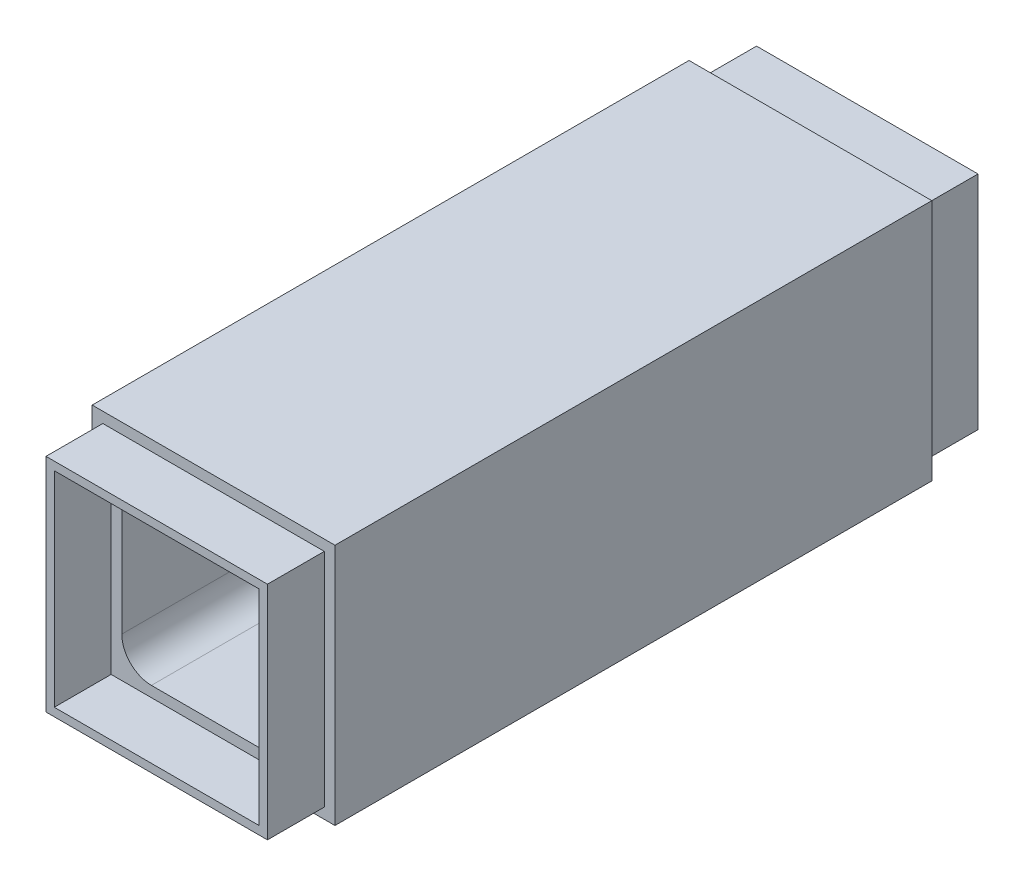
ISO-10303-21;
HEADER;
FILE_DESCRIPTION(('STEP AP214'),'2;1');
FILE_NAME('part.step','',(''),(''),'','','');
FILE_SCHEMA(('AUTOMOTIVE_DESIGN { 1 0 10303 214 1 1 1 1 }'));
ENDSEC;
DATA;
#1=APPLICATION_CONTEXT('core data for automotive mechanical design processes');
#2=APPLICATION_PROTOCOL_DEFINITION('international standard','automotive_design',2000,#1);
#3=PRODUCT_CONTEXT('',#1,'mechanical');
#4=PRODUCT('Part','Part','',(#3));
#5=PRODUCT_RELATED_PRODUCT_CATEGORY('part','',(#4));
#6=PRODUCT_DEFINITION_FORMATION('','',#4);
#7=PRODUCT_DEFINITION_CONTEXT('part definition',#1,'design');
#8=PRODUCT_DEFINITION('design','',#6,#7);
#9=PRODUCT_DEFINITION_SHAPE('','',#8);
#10=(LENGTH_UNIT() NAMED_UNIT(*) SI_UNIT(.MILLI.,.METRE.));
#11=(NAMED_UNIT(*) PLANE_ANGLE_UNIT() SI_UNIT($,.RADIAN.));
#12=(NAMED_UNIT(*) SI_UNIT($,.STERADIAN.) SOLID_ANGLE_UNIT());
#13=UNCERTAINTY_MEASURE_WITH_UNIT(LENGTH_MEASURE(1.E-05),#10,'distance_accuracy_value','');
#14=(GEOMETRIC_REPRESENTATION_CONTEXT(3) GLOBAL_UNCERTAINTY_ASSIGNED_CONTEXT((#13)) GLOBAL_UNIT_ASSIGNED_CONTEXT((#10,
#11,#12)) REPRESENTATION_CONTEXT('',''));
#15=CARTESIAN_POINT('',(0.,0.,0.));
#16=DIRECTION('',(0.,0.,1.));
#17=DIRECTION('',(1.,0.,0.));
#18=AXIS2_PLACEMENT_3D('',#15,#16,#17);
#19=CARTESIAN_POINT('',(0.,0.,-152.4));
#20=DIRECTION('',(-1.,0.,0.));
#21=DIRECTION('',(0.,0.,1.));
#22=AXIS2_PLACEMENT_3D('',#19,#20,#21);
#23=PLANE('',#22);
#24=DIRECTION('',(0.,0.,1.));
#25=VECTOR('',#24,1.);
#26=CARTESIAN_POINT('',(0.,52.07,-152.4));
#27=LINE('',#26,#25);
#28=CARTESIAN_POINT('',(0.,52.07,-140.208));
#29=VERTEX_POINT('',#28);
#30=CARTESIAN_POINT('',(0.,52.07,-12.192));
#31=VERTEX_POINT('',#30);
#32=EDGE_CURVE('E456',#29,#31,#27,.T.);
#33=ORIENTED_EDGE('',*,*,#32,.F.);
#34=DIRECTION('',(0.,-1.,0.));
#35=VECTOR('',#34,1.);
#36=CARTESIAN_POINT('',(0.,0.,-140.208));
#37=LINE('',#36,#35);
#38=CARTESIAN_POINT('',(0.,0.,-140.208));
#39=VERTEX_POINT('',#38);
#40=EDGE_CURVE('E336',#29,#39,#37,.T.);
#41=ORIENTED_EDGE('',*,*,#40,.T.);
#42=DIRECTION('',(0.,0.,1.));
#43=VECTOR('',#42,1.);
#44=CARTESIAN_POINT('',(0.,0.,-152.4));
#45=LINE('',#44,#43);
#46=CARTESIAN_POINT('',(0.,0.,-12.1920000000001));
#47=VERTEX_POINT('',#46);
#48=EDGE_CURVE('E448',#39,#47,#45,.T.);
#49=ORIENTED_EDGE('',*,*,#48,.T.);
#50=DIRECTION('',(0.,-1.,0.));
#51=VECTOR('',#50,1.);
#52=CARTESIAN_POINT('',(0.,0.,-12.192));
#53=LINE('',#52,#51);
#54=EDGE_CURVE('E415',#31,#47,#53,.T.);
#55=ORIENTED_EDGE('',*,*,#54,.F.);
#56=EDGE_LOOP('',(#33,#41,#49,#55));
#57=FACE_BOUND('',#56,.T.);
#58=ADVANCED_FACE('F85',(#57),#23,.T.);
#59=CARTESIAN_POINT('',(0.,52.07,-152.4));
#60=DIRECTION('',(0.,1.,0.));
#61=DIRECTION('',(0.,0.,1.));
#62=AXIS2_PLACEMENT_3D('',#59,#60,#61);
#63=PLANE('',#62);
#64=DIRECTION('',(0.,0.,1.));
#65=VECTOR('',#64,1.);
#66=CARTESIAN_POINT('',(52.07,52.07,-152.4));
#67=LINE('',#66,#65);
#68=CARTESIAN_POINT('',(52.07,52.07,-140.208));
#69=VERTEX_POINT('',#68);
#70=CARTESIAN_POINT('',(52.07,52.07,-12.192));
#71=VERTEX_POINT('',#70);
#72=EDGE_CURVE('E459',#69,#71,#67,.T.);
#73=ORIENTED_EDGE('',*,*,#72,.F.);
#74=DIRECTION('',(-1.,0.,0.));
#75=VECTOR('',#74,1.);
#76=CARTESIAN_POINT('',(0.,52.07,-140.208));
#77=LINE('',#76,#75);
#78=EDGE_CURVE('E326',#69,#29,#77,.T.);
#79=ORIENTED_EDGE('',*,*,#78,.T.);
#80=ORIENTED_EDGE('',*,*,#32,.T.);
#81=DIRECTION('',(-1.,0.,0.));
#82=VECTOR('',#81,1.);
#83=CARTESIAN_POINT('',(0.,52.07,-12.192));
#84=LINE('',#83,#82);
#85=EDGE_CURVE('E412',#71,#31,#84,.T.);
#86=ORIENTED_EDGE('',*,*,#85,.F.);
#87=EDGE_LOOP('',(#73,#79,#80,#86));
#88=FACE_BOUND('',#87,.T.);
#89=ADVANCED_FACE('F536',(#88),#63,.T.);
#90=CARTESIAN_POINT('',(52.07,0.,-152.4));
#91=DIRECTION('',(1.,0.,0.));
#92=DIRECTION('',(0.,0.,-1.));
#93=AXIS2_PLACEMENT_3D('',#90,#91,#92);
#94=PLANE('',#93);
#95=DIRECTION('',(0.,0.,1.));
#96=VECTOR('',#95,1.);
#97=CARTESIAN_POINT('',(52.07,0.,-152.4));
#98=LINE('',#97,#96);
#99=CARTESIAN_POINT('',(52.07,0.,-140.208));
#100=VERTEX_POINT('',#99);
#101=CARTESIAN_POINT('',(52.07,0.,-12.192));
#102=VERTEX_POINT('',#101);
#103=EDGE_CURVE('E461',#100,#102,#98,.T.);
#104=ORIENTED_EDGE('',*,*,#103,.F.);
#105=DIRECTION('',(0.,1.,0.));
#106=VECTOR('',#105,1.);
#107=CARTESIAN_POINT('',(52.07,0.,-140.208));
#108=LINE('',#107,#106);
#109=EDGE_CURVE('E329',#100,#69,#108,.T.);
#110=ORIENTED_EDGE('',*,*,#109,.T.);
#111=ORIENTED_EDGE('',*,*,#72,.T.);
#112=DIRECTION('',(0.,1.,0.));
#113=VECTOR('',#112,1.);
#114=CARTESIAN_POINT('',(52.07,0.,-12.192));
#115=LINE('',#114,#113);
#116=EDGE_CURVE('E422',#102,#71,#115,.T.);
#117=ORIENTED_EDGE('',*,*,#116,.F.);
#118=EDGE_LOOP('',(#104,#110,#111,#117));
#119=FACE_BOUND('',#118,.T.);
#120=ADVANCED_FACE('F541',(#119),#94,.T.);
#121=CARTESIAN_POINT('',(0.,0.,-152.4));
#122=DIRECTION('',(0.,-1.,0.));
#123=DIRECTION('',(0.,0.,-1.));
#124=AXIS2_PLACEMENT_3D('',#121,#122,#123);
#125=PLANE('',#124);
#126=ORIENTED_EDGE('',*,*,#48,.F.);
#127=DIRECTION('',(1.,0.,0.));
#128=VECTOR('',#127,1.);
#129=CARTESIAN_POINT('',(0.,0.,-140.208));
#130=LINE('',#129,#128);
#131=EDGE_CURVE('E333',#39,#100,#130,.T.);
#132=ORIENTED_EDGE('',*,*,#131,.T.);
#133=ORIENTED_EDGE('',*,*,#103,.T.);
#134=DIRECTION('',(1.,0.,0.));
#135=VECTOR('',#134,1.);
#136=CARTESIAN_POINT('',(0.,0.,-12.192));
#137=LINE('',#136,#135);
#138=EDGE_CURVE('E419',#47,#102,#137,.T.);
#139=ORIENTED_EDGE('',*,*,#138,.F.);
#140=EDGE_LOOP('',(#126,#132,#133,#139));
#141=FACE_BOUND('',#140,.T.);
#142=ADVANCED_FACE('F546',(#141),#125,.T.);
#143=CARTESIAN_POINT('',(6.35,45.72,-152.4));
#144=DIRECTION('',(-1.,0.,0.));
#145=DIRECTION('',(0.,-1.,0.));
#146=AXIS2_PLACEMENT_3D('',#143,#144,#145);
#147=PLANE('',#146);
#148=DIRECTION('',(0.,1.,0.));
#149=VECTOR('',#148,1.);
#150=CARTESIAN_POINT('',(6.35000000000001,0.,-140.208));
#151=LINE('',#150,#149);
#152=CARTESIAN_POINT('',(6.35,12.7,-140.208));
#153=VERTEX_POINT('',#152);
#154=CARTESIAN_POINT('',(6.35,39.37,-140.208));
#155=VERTEX_POINT('',#154);
#156=EDGE_CURVE('E310',#153,#155,#151,.T.);
#157=ORIENTED_EDGE('',*,*,#156,.T.);
#158=DIRECTION('',(0.,0.,1.));
#159=VECTOR('',#158,1.);
#160=CARTESIAN_POINT('',(6.35,39.37,-12.192));
#161=LINE('',#160,#159);
#162=CARTESIAN_POINT('',(6.35,39.37,-12.192));
#163=VERTEX_POINT('',#162);
#164=EDGE_CURVE('E465',#155,#163,#161,.T.);
#165=ORIENTED_EDGE('',*,*,#164,.T.);
#166=DIRECTION('',(0.,1.,0.));
#167=VECTOR('',#166,1.);
#168=CARTESIAN_POINT('',(6.35000000000001,0.,-12.192));
#169=LINE('',#168,#167);
#170=CARTESIAN_POINT('',(6.35,12.7,-12.192));
#171=VERTEX_POINT('',#170);
#172=EDGE_CURVE('E386',#171,#163,#169,.T.);
#173=ORIENTED_EDGE('',*,*,#172,.F.);
#174=DIRECTION('',(0.,0.,1.));
#175=VECTOR('',#174,1.);
#176=CARTESIAN_POINT('',(6.35,12.7,-140.208));
#177=LINE('',#176,#175);
#178=EDGE_CURVE('E458',#171,#153,#177,.F.);
#179=ORIENTED_EDGE('',*,*,#178,.T.);
#180=EDGE_LOOP('',(#157,#165,#173,#179));
#181=FACE_BOUND('',#180,.T.);
#182=ADVANCED_FACE('F495',(#181),#147,.F.);
#183=CARTESIAN_POINT('',(6.35,45.72,-152.4));
#184=DIRECTION('',(0.,1.,0.));
#185=DIRECTION('',(0.,0.,1.));
#186=AXIS2_PLACEMENT_3D('',#183,#184,#185);
#187=PLANE('',#186);
#188=DIRECTION('',(1.,0.,0.));
#189=VECTOR('',#188,1.);
#190=CARTESIAN_POINT('',(0.,45.72,-12.192));
#191=LINE('',#190,#189);
#192=CARTESIAN_POINT('',(12.7,45.72,-12.192));
#193=VERTEX_POINT('',#192);
#194=CARTESIAN_POINT('',(39.37,45.72,-12.192));
#195=VERTEX_POINT('',#194);
#196=EDGE_CURVE('E389',#193,#195,#191,.T.);
#197=ORIENTED_EDGE('',*,*,#196,.F.);
#198=DIRECTION('',(0.,0.,1.));
#199=VECTOR('',#198,1.);
#200=CARTESIAN_POINT('',(12.7,45.72,-140.208));
#201=LINE('',#200,#199);
#202=CARTESIAN_POINT('',(12.7,45.72,-140.208));
#203=VERTEX_POINT('',#202);
#204=EDGE_CURVE('E471',#193,#203,#201,.F.);
#205=ORIENTED_EDGE('',*,*,#204,.T.);
#206=DIRECTION('',(1.,0.,0.));
#207=VECTOR('',#206,1.);
#208=CARTESIAN_POINT('',(0.,45.72,-140.208));
#209=LINE('',#208,#207);
#210=CARTESIAN_POINT('',(39.37,45.72,-140.208));
#211=VERTEX_POINT('',#210);
#212=EDGE_CURVE('E307',#203,#211,#209,.T.);
#213=ORIENTED_EDGE('',*,*,#212,.T.);
#214=DIRECTION('',(0.,0.,1.));
#215=VECTOR('',#214,1.);
#216=CARTESIAN_POINT('',(39.37,45.72,-12.192));
#217=LINE('',#216,#215);
#218=EDGE_CURVE('E468',#211,#195,#217,.T.);
#219=ORIENTED_EDGE('',*,*,#218,.T.);
#220=EDGE_LOOP('',(#197,#205,#213,#219));
#221=FACE_BOUND('',#220,.T.);
#222=ADVANCED_FACE('F520',(#221),#187,.F.);
#223=CARTESIAN_POINT('',(45.72,45.72,-152.4));
#224=DIRECTION('',(1.,0.,0.));
#225=DIRECTION('',(0.,1.,0.));
#226=AXIS2_PLACEMENT_3D('',#223,#224,#225);
#227=PLANE('',#226);
#228=DIRECTION('',(0.,-1.,0.));
#229=VECTOR('',#228,1.);
#230=CARTESIAN_POINT('',(45.72,0.,-12.192));
#231=LINE('',#230,#229);
#232=CARTESIAN_POINT('',(45.72,39.37,-12.192));
#233=VERTEX_POINT('',#232);
#234=CARTESIAN_POINT('',(45.72,12.7,-12.192));
#235=VERTEX_POINT('',#234);
#236=EDGE_CURVE('E382',#233,#235,#231,.T.);
#237=ORIENTED_EDGE('',*,*,#236,.F.);
#238=DIRECTION('',(0.,0.,1.));
#239=VECTOR('',#238,1.);
#240=CARTESIAN_POINT('',(45.72,39.37,-140.208));
#241=LINE('',#240,#239);
#242=CARTESIAN_POINT('',(45.72,39.37,-140.208));
#243=VERTEX_POINT('',#242);
#244=EDGE_CURVE('E476',#233,#243,#241,.F.);
#245=ORIENTED_EDGE('',*,*,#244,.T.);
#246=DIRECTION('',(0.,-1.,0.));
#247=VECTOR('',#246,1.);
#248=CARTESIAN_POINT('',(45.72,0.,-140.208));
#249=LINE('',#248,#247);
#250=CARTESIAN_POINT('',(45.72,12.7,-140.208));
#251=VERTEX_POINT('',#250);
#252=EDGE_CURVE('E304',#243,#251,#249,.T.);
#253=ORIENTED_EDGE('',*,*,#252,.T.);
#254=DIRECTION('',(0.,0.,1.));
#255=VECTOR('',#254,1.);
#256=CARTESIAN_POINT('',(45.72,12.7,-12.1920000000001));
#257=LINE('',#256,#255);
#258=EDGE_CURVE('E473',#251,#235,#257,.T.);
#259=ORIENTED_EDGE('',*,*,#258,.T.);
#260=EDGE_LOOP('',(#237,#245,#253,#259));
#261=FACE_BOUND('',#260,.T.);
#262=ADVANCED_FACE('F511',(#261),#227,.F.);
#263=CARTESIAN_POINT('',(6.35,6.35,-152.4));
#264=DIRECTION('',(0.,-1.,0.));
#265=DIRECTION('',(0.,0.,-1.));
#266=AXIS2_PLACEMENT_3D('',#263,#264,#265);
#267=PLANE('',#266);
#268=DIRECTION('',(-1.,0.,0.));
#269=VECTOR('',#268,1.);
#270=CARTESIAN_POINT('',(0.,6.35,-12.192));
#271=LINE('',#270,#269);
#272=CARTESIAN_POINT('',(39.37,6.35,-12.192));
#273=VERTEX_POINT('',#272);
#274=CARTESIAN_POINT('',(12.7,6.35,-12.192));
#275=VERTEX_POINT('',#274);
#276=EDGE_CURVE('E384',#273,#275,#271,.T.);
#277=ORIENTED_EDGE('',*,*,#276,.F.);
#278=DIRECTION('',(0.,0.,1.));
#279=VECTOR('',#278,1.);
#280=CARTESIAN_POINT('',(39.37,6.35,-140.208));
#281=LINE('',#280,#279);
#282=CARTESIAN_POINT('',(39.37,6.35,-140.208));
#283=VERTEX_POINT('',#282);
#284=EDGE_CURVE('E480',#273,#283,#281,.F.);
#285=ORIENTED_EDGE('',*,*,#284,.T.);
#286=DIRECTION('',(-1.,0.,0.));
#287=VECTOR('',#286,1.);
#288=CARTESIAN_POINT('',(0.,6.35,-140.208));
#289=LINE('',#288,#287);
#290=CARTESIAN_POINT('',(12.7,6.35,-140.208));
#291=VERTEX_POINT('',#290);
#292=EDGE_CURVE('E290',#283,#291,#289,.T.);
#293=ORIENTED_EDGE('',*,*,#292,.T.);
#294=DIRECTION('',(0.,0.,1.));
#295=VECTOR('',#294,1.);
#296=CARTESIAN_POINT('',(12.7,6.35,-12.192));
#297=LINE('',#296,#295);
#298=EDGE_CURVE('E478',#291,#275,#297,.T.);
#299=ORIENTED_EDGE('',*,*,#298,.T.);
#300=EDGE_LOOP('',(#277,#285,#293,#299));
#301=FACE_BOUND('',#300,.T.);
#302=ADVANCED_FACE('F503',(#301),#267,.F.);
#303=CARTESIAN_POINT('',(48.006,0.,-12.192));
#304=DIRECTION('',(-1.,0.,0.));
#305=DIRECTION('',(0.,-1.,0.));
#306=AXIS2_PLACEMENT_3D('',#303,#304,#305);
#307=PLANE('',#306);
#308=DIRECTION('',(0.,-1.,0.));
#309=VECTOR('',#308,1.);
#310=CARTESIAN_POINT('',(48.006,0.,0.));
#311=LINE('',#310,#309);
#312=CARTESIAN_POINT('',(48.006,48.006,0.));
#313=VERTEX_POINT('',#312);
#314=CARTESIAN_POINT('',(48.006,4.064,0.));
#315=VERTEX_POINT('',#314);
#316=EDGE_CURVE('E364',#313,#315,#311,.T.);
#317=ORIENTED_EDGE('',*,*,#316,.F.);
#318=DIRECTION('',(0.,0.,1.));
#319=VECTOR('',#318,1.);
#320=CARTESIAN_POINT('',(48.006,48.006,-12.192));
#321=LINE('',#320,#319);
#322=CARTESIAN_POINT('',(48.006,48.006,-12.192));
#323=VERTEX_POINT('',#322);
#324=EDGE_CURVE('E392',#323,#313,#321,.T.);
#325=ORIENTED_EDGE('',*,*,#324,.F.);
#326=DIRECTION('',(0.,-1.,0.));
#327=VECTOR('',#326,1.);
#328=CARTESIAN_POINT('',(48.006,0.,-12.192));
#329=LINE('',#328,#327);
#330=CARTESIAN_POINT('',(48.006,4.064,-12.192));
#331=VERTEX_POINT('',#330);
#332=EDGE_CURVE('E371',#323,#331,#329,.T.);
#333=ORIENTED_EDGE('',*,*,#332,.T.);
#334=DIRECTION('',(0.,0.,1.));
#335=VECTOR('',#334,1.);
#336=CARTESIAN_POINT('',(48.006,4.064,-12.192));
#337=LINE('',#336,#335);
#338=EDGE_CURVE('E403',#331,#315,#337,.T.);
#339=ORIENTED_EDGE('',*,*,#338,.T.);
#340=EDGE_LOOP('',(#317,#325,#333,#339));
#341=FACE_BOUND('',#340,.T.);
#342=ADVANCED_FACE('F562',(#341),#307,.T.);
#343=CARTESIAN_POINT('',(0.,4.064,-12.192));
#344=DIRECTION('',(0.,-1.,0.));
#345=DIRECTION('',(0.,0.,-1.));
#346=AXIS2_PLACEMENT_3D('',#343,#344,#345);
#347=PLANE('',#346);
#348=DIRECTION('',(1.,0.,0.));
#349=VECTOR('',#348,1.);
#350=CARTESIAN_POINT('',(0.,4.064,0.));
#351=LINE('',#350,#349);
#352=CARTESIAN_POINT('',(4.06400000000001,4.064,0.));
#353=VERTEX_POINT('',#352);
#354=EDGE_CURVE('E374',#353,#315,#351,.T.);
#355=ORIENTED_EDGE('',*,*,#354,.T.);
#356=ORIENTED_EDGE('',*,*,#338,.F.);
#357=DIRECTION('',(1.,0.,0.));
#358=VECTOR('',#357,1.);
#359=CARTESIAN_POINT('',(0.,4.064,-12.192));
#360=LINE('',#359,#358);
#361=CARTESIAN_POINT('',(4.06400000000001,4.064,-12.192));
#362=VERTEX_POINT('',#361);
#363=EDGE_CURVE('E379',#362,#331,#360,.T.);
#364=ORIENTED_EDGE('',*,*,#363,.F.);
#365=DIRECTION('',(0.,0.,1.));
#366=VECTOR('',#365,1.);
#367=CARTESIAN_POINT('',(4.06400000000001,4.064,-12.192));
#368=LINE('',#367,#366);
#369=EDGE_CURVE('E406',#362,#353,#368,.T.);
#370=ORIENTED_EDGE('',*,*,#369,.T.);
#371=EDGE_LOOP('',(#355,#356,#364,#370));
#372=FACE_BOUND('',#371,.T.);
#373=ADVANCED_FACE('F589',(#372),#347,.F.);
#374=CARTESIAN_POINT('',(4.06400000000001,0.,-12.192));
#375=DIRECTION('',(-1.,0.,0.));
#376=DIRECTION('',(0.,-1.,0.));
#377=AXIS2_PLACEMENT_3D('',#374,#375,#376);
#378=PLANE('',#377);
#379=DIRECTION('',(0.,-1.,0.));
#380=VECTOR('',#379,1.);
#381=CARTESIAN_POINT('',(4.06400000000001,0.,0.));
#382=LINE('',#381,#380);
#383=CARTESIAN_POINT('',(4.064,48.006,0.));
#384=VERTEX_POINT('',#383);
#385=EDGE_CURVE('E398',#384,#353,#382,.T.);
#386=ORIENTED_EDGE('',*,*,#385,.T.);
#387=ORIENTED_EDGE('',*,*,#369,.F.);
#388=DIRECTION('',(0.,-1.,0.));
#389=VECTOR('',#388,1.);
#390=CARTESIAN_POINT('',(4.06400000000001,0.,-12.192));
#391=LINE('',#390,#389);
#392=CARTESIAN_POINT('',(4.064,48.006,-12.192));
#393=VERTEX_POINT('',#392);
#394=EDGE_CURVE('E376',#393,#362,#391,.T.);
#395=ORIENTED_EDGE('',*,*,#394,.F.);
#396=DIRECTION('',(0.,0.,1.));
#397=VECTOR('',#396,1.);
#398=CARTESIAN_POINT('',(4.064,48.006,-12.192));
#399=LINE('',#398,#397);
#400=EDGE_CURVE('E408',#393,#384,#399,.T.);
#401=ORIENTED_EDGE('',*,*,#400,.T.);
#402=EDGE_LOOP('',(#386,#387,#395,#401));
#403=FACE_BOUND('',#402,.T.);
#404=ADVANCED_FACE('F594',(#403),#378,.F.);
#405=CARTESIAN_POINT('',(0.,48.006,-12.192));
#406=DIRECTION('',(0.,-1.,0.));
#407=DIRECTION('',(0.,0.,-1.));
#408=AXIS2_PLACEMENT_3D('',#405,#406,#407);
#409=PLANE('',#408);
#410=DIRECTION('',(1.,0.,0.));
#411=VECTOR('',#410,1.);
#412=CARTESIAN_POINT('',(0.,48.006,0.));
#413=LINE('',#412,#411);
#414=EDGE_CURVE('E395',#384,#313,#413,.T.);
#415=ORIENTED_EDGE('',*,*,#414,.F.);
#416=ORIENTED_EDGE('',*,*,#400,.F.);
#417=DIRECTION('',(1.,0.,0.));
#418=VECTOR('',#417,1.);
#419=CARTESIAN_POINT('',(0.,48.006,-12.192));
#420=LINE('',#419,#418);
#421=EDGE_CURVE('E373',#393,#323,#420,.T.);
#422=ORIENTED_EDGE('',*,*,#421,.T.);
#423=ORIENTED_EDGE('',*,*,#324,.T.);
#424=EDGE_LOOP('',(#415,#416,#422,#423));
#425=FACE_BOUND('',#424,.T.);
#426=ADVANCED_FACE('F591',(#425),#409,.T.);
#427=CARTESIAN_POINT('',(0.,0.,-12.192));
#428=DIRECTION('',(0.,0.,1.));
#429=DIRECTION('',(1.,0.,0.));
#430=AXIS2_PLACEMENT_3D('',#427,#428,#429);
#431=PLANE('',#430);
#432=ORIENTED_EDGE('',*,*,#332,.F.);
#433=ORIENTED_EDGE('',*,*,#421,.F.);
#434=ORIENTED_EDGE('',*,*,#394,.T.);
#435=ORIENTED_EDGE('',*,*,#363,.T.);
#436=EDGE_LOOP('',(#432,#433,#434,#435));
#437=FACE_BOUND('',#436,.T.);
#438=ORIENTED_EDGE('',*,*,#196,.T.);
#439=CARTESIAN_POINT('',(39.37,39.37,-12.192));
#440=DIRECTION('',(0.,0.,1.));
#441=DIRECTION('',(1.,0.,0.));
#442=AXIS2_PLACEMENT_3D('',#439,#440,#441);
#443=CIRCLE('',#442,6.35);
#444=EDGE_CURVE('E486',#195,#233,#443,.F.);
#445=ORIENTED_EDGE('',*,*,#444,.T.);
#446=ORIENTED_EDGE('',*,*,#236,.T.);
#447=CARTESIAN_POINT('',(39.37,12.7,-12.192));
#448=DIRECTION('',(0.,0.,1.));
#449=DIRECTION('',(1.,0.,0.));
#450=AXIS2_PLACEMENT_3D('',#447,#448,#449);
#451=CIRCLE('',#450,6.35);
#452=EDGE_CURVE('E107',#235,#273,#451,.F.);
#453=ORIENTED_EDGE('',*,*,#452,.T.);
#454=ORIENTED_EDGE('',*,*,#276,.T.);
#455=CARTESIAN_POINT('',(12.7,12.7,-12.192));
#456=DIRECTION('',(0.,0.,1.));
#457=DIRECTION('',(1.,0.,0.));
#458=AXIS2_PLACEMENT_3D('',#455,#456,#457);
#459=CIRCLE('',#458,6.35);
#460=EDGE_CURVE('E93',#275,#171,#459,.F.);
#461=ORIENTED_EDGE('',*,*,#460,.T.);
#462=ORIENTED_EDGE('',*,*,#172,.T.);
#463=CARTESIAN_POINT('',(12.7,39.37,-12.192));
#464=DIRECTION('',(0.,0.,1.));
#465=DIRECTION('',(1.,0.,0.));
#466=AXIS2_PLACEMENT_3D('',#463,#464,#465);
#467=CIRCLE('',#466,6.35);
#468=EDGE_CURVE('E482',#163,#193,#467,.F.);
#469=ORIENTED_EDGE('',*,*,#468,.T.);
#470=EDGE_LOOP('',(#438,#445,#446,#453,#454,#461,#462,#469));
#471=FACE_BOUND('',#470,.T.);
#472=ADVANCED_FACE('F493',(#437,#471),#431,.T.);
#473=CARTESIAN_POINT('',(0.,0.,0.));
#474=DIRECTION('',(0.,0.,-1.));
#475=DIRECTION('',(-1.,0.,0.));
#476=AXIS2_PLACEMENT_3D('',#473,#474,#475);
#477=PLANE('',#476);
#478=DIRECTION('',(0.,-1.,0.));
#479=VECTOR('',#478,1.);
#480=CARTESIAN_POINT('',(49.784,0.,0.));
#481=LINE('',#480,#479);
#482=CARTESIAN_POINT('',(49.784,49.784,0.));
#483=VERTEX_POINT('',#482);
#484=CARTESIAN_POINT('',(49.784,2.286,0.));
#485=VERTEX_POINT('',#484);
#486=EDGE_CURVE('E438',#483,#485,#481,.T.);
#487=ORIENTED_EDGE('',*,*,#486,.F.);
#488=DIRECTION('',(1.,0.,0.));
#489=VECTOR('',#488,1.);
#490=CARTESIAN_POINT('',(0.,49.784,0.));
#491=LINE('',#490,#489);
#492=CARTESIAN_POINT('',(2.286,49.784,0.));
#493=VERTEX_POINT('',#492);
#494=EDGE_CURVE('E405',#493,#483,#491,.T.);
#495=ORIENTED_EDGE('',*,*,#494,.F.);
#496=DIRECTION('',(0.,-1.,0.));
#497=VECTOR('',#496,1.);
#498=CARTESIAN_POINT('',(2.28600000000001,0.,0.));
#499=LINE('',#498,#497);
#500=CARTESIAN_POINT('',(2.28600000000001,2.286,0.));
#501=VERTEX_POINT('',#500);
#502=EDGE_CURVE('E416',#493,#501,#499,.T.);
#503=ORIENTED_EDGE('',*,*,#502,.T.);
#504=DIRECTION('',(1.,0.,0.));
#505=VECTOR('',#504,1.);
#506=CARTESIAN_POINT('',(0.,2.286,0.));
#507=LINE('',#506,#505);
#508=EDGE_CURVE('E441',#501,#485,#507,.T.);
#509=ORIENTED_EDGE('',*,*,#508,.T.);
#510=EDGE_LOOP('',(#487,#495,#503,#509));
#511=FACE_BOUND('',#510,.T.);
#512=ORIENTED_EDGE('',*,*,#316,.T.);
#513=ORIENTED_EDGE('',*,*,#354,.F.);
#514=ORIENTED_EDGE('',*,*,#385,.F.);
#515=ORIENTED_EDGE('',*,*,#414,.T.);
#516=EDGE_LOOP('',(#512,#513,#514,#515));
#517=FACE_BOUND('',#516,.T.);
#518=ADVANCED_FACE('F553',(#511,#517),#477,.F.);
#519=CARTESIAN_POINT('',(0.,49.784,-12.192));
#520=DIRECTION('',(0.,-1.,0.));
#521=DIRECTION('',(0.,0.,-1.));
#522=AXIS2_PLACEMENT_3D('',#519,#520,#521);
#523=PLANE('',#522);
#524=ORIENTED_EDGE('',*,*,#494,.T.);
#525=DIRECTION('',(0.,0.,1.));
#526=VECTOR('',#525,1.);
#527=CARTESIAN_POINT('',(49.784,49.784,-12.192));
#528=LINE('',#527,#526);
#529=CARTESIAN_POINT('',(49.784,49.784,-12.192));
#530=VERTEX_POINT('',#529);
#531=EDGE_CURVE('E436',#530,#483,#528,.T.);
#532=ORIENTED_EDGE('',*,*,#531,.F.);
#533=DIRECTION('',(1.,0.,0.));
#534=VECTOR('',#533,1.);
#535=CARTESIAN_POINT('',(0.,49.784,-12.192));
#536=LINE('',#535,#534);
#537=CARTESIAN_POINT('',(2.286,49.784,-12.192));
#538=VERTEX_POINT('',#537);
#539=EDGE_CURVE('E425',#538,#530,#536,.T.);
#540=ORIENTED_EDGE('',*,*,#539,.F.);
#541=DIRECTION('',(0.,0.,1.));
#542=VECTOR('',#541,1.);
#543=CARTESIAN_POINT('',(2.286,49.784,-12.192));
#544=LINE('',#543,#542);
#545=EDGE_CURVE('E446',#538,#493,#544,.T.);
#546=ORIENTED_EDGE('',*,*,#545,.T.);
#547=EDGE_LOOP('',(#524,#532,#540,#546));
#548=FACE_BOUND('',#547,.T.);
#549=ADVANCED_FACE('F555',(#548),#523,.F.);
#550=CARTESIAN_POINT('',(2.28600000000001,0.,-12.192));
#551=DIRECTION('',(-1.,0.,0.));
#552=DIRECTION('',(0.,-1.,0.));
#553=AXIS2_PLACEMENT_3D('',#550,#551,#552);
#554=PLANE('',#553);
#555=ORIENTED_EDGE('',*,*,#502,.F.);
#556=ORIENTED_EDGE('',*,*,#545,.F.);
#557=DIRECTION('',(0.,-1.,0.));
#558=VECTOR('',#557,1.);
#559=CARTESIAN_POINT('',(2.28600000000001,0.,-12.192));
#560=LINE('',#559,#558);
#561=CARTESIAN_POINT('',(2.28600000000001,2.286,-12.192));
#562=VERTEX_POINT('',#561);
#563=EDGE_CURVE('E433',#538,#562,#560,.T.);
#564=ORIENTED_EDGE('',*,*,#563,.T.);
#565=DIRECTION('',(0.,0.,1.));
#566=VECTOR('',#565,1.);
#567=CARTESIAN_POINT('',(2.28600000000001,2.286,-12.192));
#568=LINE('',#567,#566);
#569=EDGE_CURVE('E449',#562,#501,#568,.T.);
#570=ORIENTED_EDGE('',*,*,#569,.T.);
#571=EDGE_LOOP('',(#555,#556,#564,#570));
#572=FACE_BOUND('',#571,.T.);
#573=ADVANCED_FACE('F569',(#572),#554,.T.);
#574=CARTESIAN_POINT('',(0.,2.286,-12.192));
#575=DIRECTION('',(0.,-1.,0.));
#576=DIRECTION('',(0.,0.,-1.));
#577=AXIS2_PLACEMENT_3D('',#574,#575,#576);
#578=PLANE('',#577);
#579=ORIENTED_EDGE('',*,*,#508,.F.);
#580=ORIENTED_EDGE('',*,*,#569,.F.);
#581=DIRECTION('',(1.,0.,0.));
#582=VECTOR('',#581,1.);
#583=CARTESIAN_POINT('',(0.,2.286,-12.192));
#584=LINE('',#583,#582);
#585=CARTESIAN_POINT('',(49.784,2.286,-12.192));
#586=VERTEX_POINT('',#585);
#587=EDGE_CURVE('E431',#562,#586,#584,.T.);
#588=ORIENTED_EDGE('',*,*,#587,.T.);
#589=DIRECTION('',(0.,0.,1.));
#590=VECTOR('',#589,1.);
#591=CARTESIAN_POINT('',(49.784,2.286,-12.192));
#592=LINE('',#591,#590);
#593=EDGE_CURVE('E452',#586,#485,#592,.T.);
#594=ORIENTED_EDGE('',*,*,#593,.T.);
#595=EDGE_LOOP('',(#579,#580,#588,#594));
#596=FACE_BOUND('',#595,.T.);
#597=ADVANCED_FACE('F575',(#596),#578,.T.);
#598=CARTESIAN_POINT('',(49.784,0.,-12.192));
#599=DIRECTION('',(-1.,0.,0.));
#600=DIRECTION('',(0.,-1.,0.));
#601=AXIS2_PLACEMENT_3D('',#598,#599,#600);
#602=PLANE('',#601);
#603=ORIENTED_EDGE('',*,*,#486,.T.);
#604=ORIENTED_EDGE('',*,*,#593,.F.);
#605=DIRECTION('',(0.,-1.,0.));
#606=VECTOR('',#605,1.);
#607=CARTESIAN_POINT('',(49.784,0.,-12.192));
#608=LINE('',#607,#606);
#609=EDGE_CURVE('E428',#530,#586,#608,.T.);
#610=ORIENTED_EDGE('',*,*,#609,.F.);
#611=ORIENTED_EDGE('',*,*,#531,.T.);
#612=EDGE_LOOP('',(#603,#604,#610,#611));
#613=FACE_BOUND('',#612,.T.);
#614=ADVANCED_FACE('F571',(#613),#602,.F.);
#615=CARTESIAN_POINT('',(0.,0.,-12.192));
#616=DIRECTION('',(0.,0.,1.));
#617=DIRECTION('',(1.,0.,0.));
#618=AXIS2_PLACEMENT_3D('',#615,#616,#617);
#619=PLANE('',#618);
#620=ORIENTED_EDGE('',*,*,#85,.T.);
#621=ORIENTED_EDGE('',*,*,#54,.T.);
#622=ORIENTED_EDGE('',*,*,#138,.T.);
#623=ORIENTED_EDGE('',*,*,#116,.T.);
#624=EDGE_LOOP('',(#620,#621,#622,#623));
#625=FACE_BOUND('',#624,.T.);
#626=ORIENTED_EDGE('',*,*,#539,.T.);
#627=ORIENTED_EDGE('',*,*,#609,.T.);
#628=ORIENTED_EDGE('',*,*,#587,.F.);
#629=ORIENTED_EDGE('',*,*,#563,.F.);
#630=EDGE_LOOP('',(#626,#627,#628,#629));
#631=FACE_BOUND('',#630,.T.);
#632=ADVANCED_FACE('F574',(#625,#631),#619,.T.);
#633=CARTESIAN_POINT('',(0.,49.784,-140.208));
#634=DIRECTION('',(0.,1.,0.));
#635=DIRECTION('',(0.,0.,1.));
#636=AXIS2_PLACEMENT_3D('',#633,#634,#635);
#637=PLANE('',#636);
#638=DIRECTION('',(1.,0.,0.));
#639=VECTOR('',#638,1.);
#640=CARTESIAN_POINT('',(0.,49.784,-152.4));
#641=LINE('',#640,#639);
#642=CARTESIAN_POINT('',(2.286,49.784,-152.4));
#643=VERTEX_POINT('',#642);
#644=CARTESIAN_POINT('',(49.784,49.784,-152.4));
#645=VERTEX_POINT('',#644);
#646=EDGE_CURVE('E322',#643,#645,#641,.T.);
#647=ORIENTED_EDGE('',*,*,#646,.F.);
#648=DIRECTION('',(0.,0.,-1.));
#649=VECTOR('',#648,1.);
#650=CARTESIAN_POINT('',(2.286,49.784,-140.208));
#651=LINE('',#650,#649);
#652=CARTESIAN_POINT('',(2.286,49.784,-140.208));
#653=VERTEX_POINT('',#652);
#654=EDGE_CURVE('E350',#653,#643,#651,.T.);
#655=ORIENTED_EDGE('',*,*,#654,.F.);
#656=DIRECTION('',(1.,0.,0.));
#657=VECTOR('',#656,1.);
#658=CARTESIAN_POINT('',(0.,49.784,-140.208));
#659=LINE('',#658,#657);
#660=CARTESIAN_POINT('',(49.784,49.784,-140.208));
#661=VERTEX_POINT('',#660);
#662=EDGE_CURVE('E339',#653,#661,#659,.T.);
#663=ORIENTED_EDGE('',*,*,#662,.T.);
#664=DIRECTION('',(0.,0.,-1.));
#665=VECTOR('',#664,1.);
#666=CARTESIAN_POINT('',(49.784,49.784,-140.208));
#667=LINE('',#666,#665);
#668=EDGE_CURVE('E361',#661,#645,#667,.T.);
#669=ORIENTED_EDGE('',*,*,#668,.T.);
#670=EDGE_LOOP('',(#647,#655,#663,#669));
#671=FACE_BOUND('',#670,.T.);
#672=ADVANCED_FACE('F585',(#671),#637,.T.);
#673=CARTESIAN_POINT('',(49.784,0.,-140.208));
#674=DIRECTION('',(1.,0.,0.));
#675=DIRECTION('',(0.,1.,0.));
#676=AXIS2_PLACEMENT_3D('',#673,#674,#675);
#677=PLANE('',#676);
#678=DIRECTION('',(0.,-1.,0.));
#679=VECTOR('',#678,1.);
#680=CARTESIAN_POINT('',(49.784,0.,-152.4));
#681=LINE('',#680,#679);
#682=CARTESIAN_POINT('',(49.784,2.286,-152.4));
#683=VERTEX_POINT('',#682);
#684=EDGE_CURVE('E330',#645,#683,#681,.T.);
#685=ORIENTED_EDGE('',*,*,#684,.F.);
#686=ORIENTED_EDGE('',*,*,#668,.F.);
#687=DIRECTION('',(0.,-1.,0.));
#688=VECTOR('',#687,1.);
#689=CARTESIAN_POINT('',(49.784,0.,-140.208));
#690=LINE('',#689,#688);
#691=CARTESIAN_POINT('',(49.784,2.286,-140.208));
#692=VERTEX_POINT('',#691);
#693=EDGE_CURVE('E348',#661,#692,#690,.T.);
#694=ORIENTED_EDGE('',*,*,#693,.T.);
#695=DIRECTION('',(0.,0.,-1.));
#696=VECTOR('',#695,1.);
#697=CARTESIAN_POINT('',(49.784,2.286,-140.208));
#698=LINE('',#697,#696);
#699=EDGE_CURVE('E365',#692,#683,#698,.T.);
#700=ORIENTED_EDGE('',*,*,#699,.T.);
#701=EDGE_LOOP('',(#685,#686,#694,#700));
#702=FACE_BOUND('',#701,.T.);
#703=ADVANCED_FACE('F607',(#702),#677,.T.);
#704=CARTESIAN_POINT('',(0.,2.286,-140.208));
#705=DIRECTION('',(0.,1.,0.));
#706=DIRECTION('',(0.,0.,1.));
#707=AXIS2_PLACEMENT_3D('',#704,#705,#706);
#708=PLANE('',#707);
#709=DIRECTION('',(1.,0.,0.));
#710=VECTOR('',#709,1.);
#711=CARTESIAN_POINT('',(0.,2.286,-152.4));
#712=LINE('',#711,#710);
#713=CARTESIAN_POINT('',(2.28600000000001,2.286,-152.4));
#714=VERTEX_POINT('',#713);
#715=EDGE_CURVE('E356',#714,#683,#712,.T.);
#716=ORIENTED_EDGE('',*,*,#715,.T.);
#717=ORIENTED_EDGE('',*,*,#699,.F.);
#718=DIRECTION('',(1.,0.,0.));
#719=VECTOR('',#718,1.);
#720=CARTESIAN_POINT('',(0.,2.286,-140.208));
#721=LINE('',#720,#719);
#722=CARTESIAN_POINT('',(2.28600000000001,2.286,-140.208));
#723=VERTEX_POINT('',#722);
#724=EDGE_CURVE('E345',#723,#692,#721,.T.);
#725=ORIENTED_EDGE('',*,*,#724,.F.);
#726=DIRECTION('',(0.,0.,-1.));
#727=VECTOR('',#726,1.);
#728=CARTESIAN_POINT('',(2.28600000000001,2.286,-140.208));
#729=LINE('',#728,#727);
#730=EDGE_CURVE('E367',#723,#714,#729,.T.);
#731=ORIENTED_EDGE('',*,*,#730,.T.);
#732=EDGE_LOOP('',(#716,#717,#725,#731));
#733=FACE_BOUND('',#732,.T.);
#734=ADVANCED_FACE('F613',(#733),#708,.F.);
#735=CARTESIAN_POINT('',(2.28600000000001,0.,-140.208));
#736=DIRECTION('',(1.,0.,0.));
#737=DIRECTION('',(0.,1.,0.));
#738=AXIS2_PLACEMENT_3D('',#735,#736,#737);
#739=PLANE('',#738);
#740=DIRECTION('',(0.,-1.,0.));
#741=VECTOR('',#740,1.);
#742=CARTESIAN_POINT('',(2.28600000000001,0.,-152.4));
#743=LINE('',#742,#741);
#744=EDGE_CURVE('E353',#643,#714,#743,.T.);
#745=ORIENTED_EDGE('',*,*,#744,.T.);
#746=ORIENTED_EDGE('',*,*,#730,.F.);
#747=DIRECTION('',(0.,-1.,0.));
#748=VECTOR('',#747,1.);
#749=CARTESIAN_POINT('',(2.28600000000001,0.,-140.208));
#750=LINE('',#749,#748);
#751=EDGE_CURVE('E342',#653,#723,#750,.T.);
#752=ORIENTED_EDGE('',*,*,#751,.F.);
#753=ORIENTED_EDGE('',*,*,#654,.T.);
#754=EDGE_LOOP('',(#745,#746,#752,#753));
#755=FACE_BOUND('',#754,.T.);
#756=ADVANCED_FACE('F609',(#755),#739,.F.);
#757=CARTESIAN_POINT('',(0.,0.,-140.208));
#758=DIRECTION('',(0.,0.,-1.));
#759=DIRECTION('',(1.,0.,0.));
#760=AXIS2_PLACEMENT_3D('',#757,#758,#759);
#761=PLANE('',#760);
#762=ORIENTED_EDGE('',*,*,#78,.F.);
#763=ORIENTED_EDGE('',*,*,#109,.F.);
#764=ORIENTED_EDGE('',*,*,#131,.F.);
#765=ORIENTED_EDGE('',*,*,#40,.F.);
#766=EDGE_LOOP('',(#762,#763,#764,#765));
#767=FACE_BOUND('',#766,.T.);
#768=ORIENTED_EDGE('',*,*,#662,.F.);
#769=ORIENTED_EDGE('',*,*,#751,.T.);
#770=ORIENTED_EDGE('',*,*,#724,.T.);
#771=ORIENTED_EDGE('',*,*,#693,.F.);
#772=EDGE_LOOP('',(#768,#769,#770,#771));
#773=FACE_BOUND('',#772,.T.);
#774=ADVANCED_FACE('F612',(#767,#773),#761,.T.);
#775=CARTESIAN_POINT('',(48.006,0.,-140.208));
#776=DIRECTION('',(1.,0.,0.));
#777=DIRECTION('',(0.,1.,0.));
#778=AXIS2_PLACEMENT_3D('',#775,#776,#777);
#779=PLANE('',#778);
#780=DIRECTION('',(0.,-1.,0.));
#781=VECTOR('',#780,1.);
#782=CARTESIAN_POINT('',(48.006,0.,-152.4));
#783=LINE('',#782,#781);
#784=CARTESIAN_POINT('',(48.006,48.006,-152.4));
#785=VERTEX_POINT('',#784);
#786=CARTESIAN_POINT('',(48.006,4.064,-152.4));
#787=VERTEX_POINT('',#786);
#788=EDGE_CURVE('E289',#785,#787,#783,.T.);
#789=ORIENTED_EDGE('',*,*,#788,.T.);
#790=DIRECTION('',(0.,0.,-1.));
#791=VECTOR('',#790,1.);
#792=CARTESIAN_POINT('',(48.006,4.064,-140.208));
#793=LINE('',#792,#791);
#794=CARTESIAN_POINT('',(48.006,4.064,-140.208));
#795=VERTEX_POINT('',#794);
#796=EDGE_CURVE('E275',#795,#787,#793,.T.);
#797=ORIENTED_EDGE('',*,*,#796,.F.);
#798=DIRECTION('',(0.,-1.,0.));
#799=VECTOR('',#798,1.);
#800=CARTESIAN_POINT('',(48.006,0.,-140.208));
#801=LINE('',#800,#799);
#802=CARTESIAN_POINT('',(48.006,48.006,-140.208));
#803=VERTEX_POINT('',#802);
#804=EDGE_CURVE('E282',#803,#795,#801,.T.);
#805=ORIENTED_EDGE('',*,*,#804,.F.);
#806=DIRECTION('',(0.,0.,-1.));
#807=VECTOR('',#806,1.);
#808=CARTESIAN_POINT('',(48.006,48.006,-140.208));
#809=LINE('',#808,#807);
#810=EDGE_CURVE('E320',#803,#785,#809,.T.);
#811=ORIENTED_EDGE('',*,*,#810,.T.);
#812=EDGE_LOOP('',(#789,#797,#805,#811));
#813=FACE_BOUND('',#812,.T.);
#814=ADVANCED_FACE('F286',(#813),#779,.F.);
#815=CARTESIAN_POINT('',(0.,48.006,-140.208));
#816=DIRECTION('',(0.,1.,0.));
#817=DIRECTION('',(0.,0.,1.));
#818=AXIS2_PLACEMENT_3D('',#815,#816,#817);
#819=PLANE('',#818);
#820=DIRECTION('',(1.,0.,0.));
#821=VECTOR('',#820,1.);
#822=CARTESIAN_POINT('',(0.,48.006,-152.4));
#823=LINE('',#822,#821);
#824=CARTESIAN_POINT('',(4.064,48.006,-152.4));
#825=VERTEX_POINT('',#824);
#826=EDGE_CURVE('E296',#825,#785,#823,.T.);
#827=ORIENTED_EDGE('',*,*,#826,.T.);
#828=ORIENTED_EDGE('',*,*,#810,.F.);
#829=DIRECTION('',(1.,0.,0.));
#830=VECTOR('',#829,1.);
#831=CARTESIAN_POINT('',(0.,48.006,-140.208));
#832=LINE('',#831,#830);
#833=CARTESIAN_POINT('',(4.064,48.006,-140.208));
#834=VERTEX_POINT('',#833);
#835=EDGE_CURVE('E295',#834,#803,#832,.T.);
#836=ORIENTED_EDGE('',*,*,#835,.F.);
#837=DIRECTION('',(0.,0.,-1.));
#838=VECTOR('',#837,1.);
#839=CARTESIAN_POINT('',(4.064,48.006,-140.208));
#840=LINE('',#839,#838);
#841=EDGE_CURVE('E323',#834,#825,#840,.T.);
#842=ORIENTED_EDGE('',*,*,#841,.T.);
#843=EDGE_LOOP('',(#827,#828,#836,#842));
#844=FACE_BOUND('',#843,.T.);
#845=ADVANCED_FACE('F626',(#844),#819,.F.);
#846=CARTESIAN_POINT('',(4.06400000000001,0.,-140.208));
#847=DIRECTION('',(1.,0.,0.));
#848=DIRECTION('',(0.,1.,0.));
#849=AXIS2_PLACEMENT_3D('',#846,#847,#848);
#850=PLANE('',#849);
#851=DIRECTION('',(0.,-1.,0.));
#852=VECTOR('',#851,1.);
#853=CARTESIAN_POINT('',(4.06400000000001,0.,-152.4));
#854=LINE('',#853,#852);
#855=CARTESIAN_POINT('',(4.06400000000001,4.064,-152.4));
#856=VERTEX_POINT('',#855);
#857=EDGE_CURVE('E299',#825,#856,#854,.T.);
#858=ORIENTED_EDGE('',*,*,#857,.F.);
#859=ORIENTED_EDGE('',*,*,#841,.F.);
#860=DIRECTION('',(0.,-1.,0.));
#861=VECTOR('',#860,1.);
#862=CARTESIAN_POINT('',(4.06400000000001,0.,-140.208));
#863=LINE('',#862,#861);
#864=CARTESIAN_POINT('',(4.06400000000001,4.064,-140.208));
#865=VERTEX_POINT('',#864);
#866=EDGE_CURVE('E281',#834,#865,#863,.T.);
#867=ORIENTED_EDGE('',*,*,#866,.T.);
#868=DIRECTION('',(0.,0.,-1.));
#869=VECTOR('',#868,1.);
#870=CARTESIAN_POINT('',(4.06400000000001,4.064,-140.208));
#871=LINE('',#870,#869);
#872=EDGE_CURVE('E277',#865,#856,#871,.T.);
#873=ORIENTED_EDGE('',*,*,#872,.T.);
#874=EDGE_LOOP('',(#858,#859,#867,#873));
#875=FACE_BOUND('',#874,.T.);
#876=ADVANCED_FACE('F629',(#875),#850,.T.);
#877=CARTESIAN_POINT('',(0.,4.064,-140.208));
#878=DIRECTION('',(0.,1.,0.));
#879=DIRECTION('',(0.,0.,1.));
#880=AXIS2_PLACEMENT_3D('',#877,#878,#879);
#881=PLANE('',#880);
#882=DIRECTION('',(1.,0.,0.));
#883=VECTOR('',#882,1.);
#884=CARTESIAN_POINT('',(0.,4.064,-152.4));
#885=LINE('',#884,#883);
#886=EDGE_CURVE('E316',#856,#787,#885,.T.);
#887=ORIENTED_EDGE('',*,*,#886,.F.);
#888=ORIENTED_EDGE('',*,*,#872,.F.);
#889=DIRECTION('',(1.,0.,0.));
#890=VECTOR('',#889,1.);
#891=CARTESIAN_POINT('',(0.,4.064,-140.208));
#892=LINE('',#891,#890);
#893=EDGE_CURVE('E271',#865,#795,#892,.T.);
#894=ORIENTED_EDGE('',*,*,#893,.T.);
#895=ORIENTED_EDGE('',*,*,#796,.T.);
#896=EDGE_LOOP('',(#887,#888,#894,#895));
#897=FACE_BOUND('',#896,.T.);
#898=ADVANCED_FACE('F274',(#897),#881,.T.);
#899=CARTESIAN_POINT('',(0.,0.,-140.208));
#900=DIRECTION('',(0.,0.,-1.));
#901=DIRECTION('',(1.,0.,0.));
#902=AXIS2_PLACEMENT_3D('',#899,#900,#901);
#903=PLANE('',#902);
#904=ORIENTED_EDGE('',*,*,#804,.T.);
#905=ORIENTED_EDGE('',*,*,#893,.F.);
#906=ORIENTED_EDGE('',*,*,#866,.F.);
#907=ORIENTED_EDGE('',*,*,#835,.T.);
#908=EDGE_LOOP('',(#904,#905,#906,#907));
#909=FACE_BOUND('',#908,.T.);
#910=ORIENTED_EDGE('',*,*,#252,.F.);
#911=CARTESIAN_POINT('',(39.37,39.37,-140.208));
#912=DIRECTION('',(0.,0.,-1.));
#913=DIRECTION('',(-1.,0.,0.));
#914=AXIS2_PLACEMENT_3D('',#911,#912,#913);
#915=CIRCLE('',#914,6.35);
#916=EDGE_CURVE('E488',#243,#211,#915,.F.);
#917=ORIENTED_EDGE('',*,*,#916,.T.);
#918=ORIENTED_EDGE('',*,*,#212,.F.);
#919=CARTESIAN_POINT('',(12.7,39.37,-140.208));
#920=DIRECTION('',(0.,0.,-1.));
#921=DIRECTION('',(-1.,0.,0.));
#922=AXIS2_PLACEMENT_3D('',#919,#920,#921);
#923=CIRCLE('',#922,6.35);
#924=EDGE_CURVE('E484',#203,#155,#923,.F.);
#925=ORIENTED_EDGE('',*,*,#924,.T.);
#926=ORIENTED_EDGE('',*,*,#156,.F.);
#927=CARTESIAN_POINT('',(12.7,12.7,-140.208));
#928=DIRECTION('',(0.,0.,-1.));
#929=DIRECTION('',(-1.,0.,0.));
#930=AXIS2_PLACEMENT_3D('',#927,#928,#929);
#931=CIRCLE('',#930,6.35);
#932=EDGE_CURVE('E12',#153,#291,#931,.F.);
#933=ORIENTED_EDGE('',*,*,#932,.T.);
#934=ORIENTED_EDGE('',*,*,#292,.F.);
#935=CARTESIAN_POINT('',(39.37,12.7,-140.208));
#936=DIRECTION('',(0.,0.,-1.));
#937=DIRECTION('',(-1.,0.,0.));
#938=AXIS2_PLACEMENT_3D('',#935,#936,#937);
#939=CIRCLE('',#938,6.35);
#940=EDGE_CURVE('E491',#283,#251,#939,.F.);
#941=ORIENTED_EDGE('',*,*,#940,.T.);
#942=EDGE_LOOP('',(#910,#917,#918,#925,#926,#933,#934,#941));
#943=FACE_BOUND('',#942,.T.);
#944=ADVANCED_FACE('F292',(#909,#943),#903,.T.);
#945=CARTESIAN_POINT('',(0.,0.,-152.4));
#946=DIRECTION('',(0.,0.,-1.));
#947=DIRECTION('',(-1.,0.,0.));
#948=AXIS2_PLACEMENT_3D('',#945,#946,#947);
#949=PLANE('',#948);
#950=ORIENTED_EDGE('',*,*,#788,.F.);
#951=ORIENTED_EDGE('',*,*,#826,.F.);
#952=ORIENTED_EDGE('',*,*,#857,.T.);
#953=ORIENTED_EDGE('',*,*,#886,.T.);
#954=EDGE_LOOP('',(#950,#951,#952,#953));
#955=FACE_BOUND('',#954,.T.);
#956=ORIENTED_EDGE('',*,*,#744,.F.);
#957=ORIENTED_EDGE('',*,*,#646,.T.);
#958=ORIENTED_EDGE('',*,*,#684,.T.);
#959=ORIENTED_EDGE('',*,*,#715,.F.);
#960=EDGE_LOOP('',(#956,#957,#958,#959));
#961=FACE_BOUND('',#960,.T.);
#962=ADVANCED_FACE('F525',(#955,#961),#949,.T.);
#963=CARTESIAN_POINT('',(12.7,39.37,-152.4));
#964=DIRECTION('',(0.,0.,-1.));
#965=DIRECTION('',(-1.,0.,0.));
#966=AXIS2_PLACEMENT_3D('',#963,#964,#965);
#967=CYLINDRICAL_SURFACE('',#966,6.35);
#968=ORIENTED_EDGE('',*,*,#924,.F.);
#969=ORIENTED_EDGE('',*,*,#204,.F.);
#970=ORIENTED_EDGE('',*,*,#468,.F.);
#971=ORIENTED_EDGE('',*,*,#164,.F.);
#972=EDGE_LOOP('',(#968,#969,#970,#971));
#973=FACE_BOUND('',#972,.T.);
#974=ADVANCED_FACE('F523',(#973),#967,.F.);
#975=CARTESIAN_POINT('',(39.37,39.37,-152.4));
#976=DIRECTION('',(0.,0.,-1.));
#977=DIRECTION('',(-1.,0.,0.));
#978=AXIS2_PLACEMENT_3D('',#975,#976,#977);
#979=CYLINDRICAL_SURFACE('',#978,6.35);
#980=ORIENTED_EDGE('',*,*,#916,.F.);
#981=ORIENTED_EDGE('',*,*,#244,.F.);
#982=ORIENTED_EDGE('',*,*,#444,.F.);
#983=ORIENTED_EDGE('',*,*,#218,.F.);
#984=EDGE_LOOP('',(#980,#981,#982,#983));
#985=FACE_BOUND('',#984,.T.);
#986=ADVANCED_FACE('F514',(#985),#979,.F.);
#987=CARTESIAN_POINT('',(39.37,12.7,-152.4));
#988=DIRECTION('',(0.,0.,-1.));
#989=DIRECTION('',(-1.,0.,0.));
#990=AXIS2_PLACEMENT_3D('',#987,#988,#989);
#991=CYLINDRICAL_SURFACE('',#990,6.35);
#992=ORIENTED_EDGE('',*,*,#940,.F.);
#993=ORIENTED_EDGE('',*,*,#284,.F.);
#994=ORIENTED_EDGE('',*,*,#452,.F.);
#995=ORIENTED_EDGE('',*,*,#258,.F.);
#996=EDGE_LOOP('',(#992,#993,#994,#995));
#997=FACE_BOUND('',#996,.T.);
#998=ADVANCED_FACE('F506',(#997),#991,.F.);
#999=CARTESIAN_POINT('',(12.7,12.7,-152.4));
#1000=DIRECTION('',(0.,0.,-1.));
#1001=DIRECTION('',(-1.,0.,0.));
#1002=AXIS2_PLACEMENT_3D('',#999,#1000,#1001);
#1003=CYLINDRICAL_SURFACE('',#1002,6.35);
#1004=ORIENTED_EDGE('',*,*,#932,.F.);
#1005=ORIENTED_EDGE('',*,*,#178,.F.);
#1006=ORIENTED_EDGE('',*,*,#460,.F.);
#1007=ORIENTED_EDGE('',*,*,#298,.F.);
#1008=EDGE_LOOP('',(#1004,#1005,#1006,#1007));
#1009=FACE_BOUND('',#1008,.T.);
#1010=ADVANCED_FACE('F87',(#1009),#1003,.F.);
#1011=CLOSED_SHELL('',(#58,#89,#120,#142,#182,#222,#262,#302,#342,#373,#404,#426,#472,#518,#549,
#573,#597,#614,#632,#672,#703,#734,#756,#774,#814,#845,#876,#898,#944,#962,#974,#986,#998,#1010));
#1012=MANIFOLD_SOLID_BREP('B2',#1011);
#1013=ADVANCED_BREP_SHAPE_REPRESENTATION('',(#18,#1012),#14);
#1014=SHAPE_DEFINITION_REPRESENTATION(#9,#1013);
ENDSEC;
END-ISO-10303-21;
